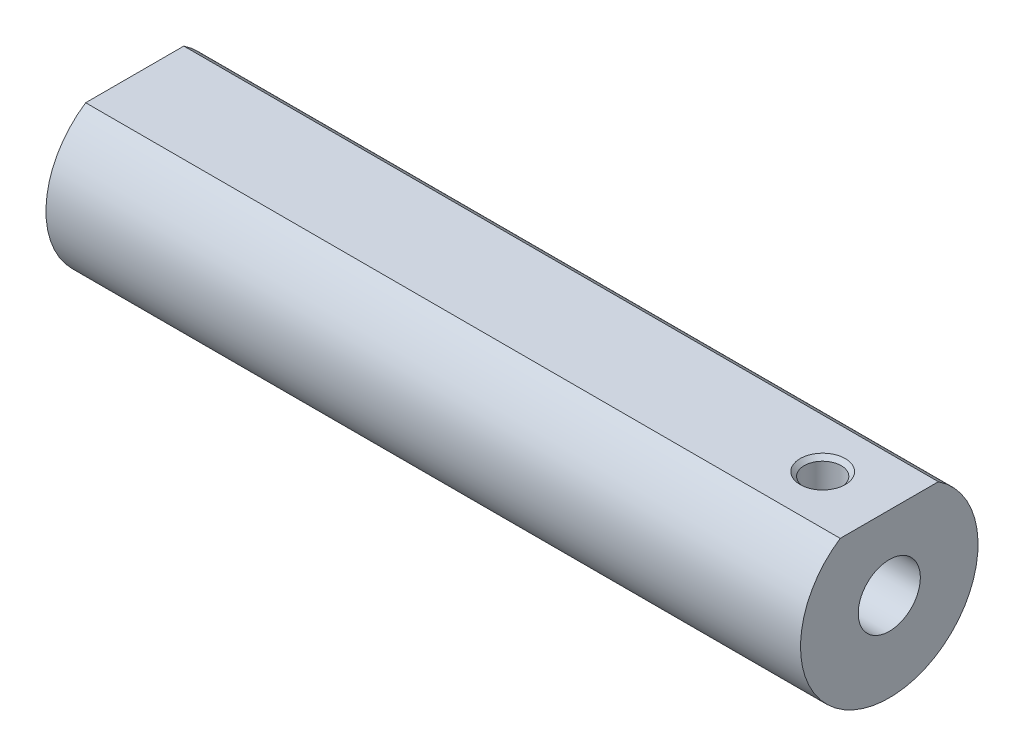
ISO-10303-21;
HEADER;
FILE_DESCRIPTION(('STEP AP214'),'2;1');
FILE_NAME('part.step','',(''),(''),'','','');
FILE_SCHEMA(('AUTOMOTIVE_DESIGN { 1 0 10303 214 1 1 1 1 }'));
ENDSEC;
DATA;
#1=APPLICATION_CONTEXT('core data for automotive mechanical design processes');
#2=APPLICATION_PROTOCOL_DEFINITION('international standard','automotive_design',2000,#1);
#3=PRODUCT_CONTEXT('',#1,'mechanical');
#4=PRODUCT('Part','Part','',(#3));
#5=PRODUCT_RELATED_PRODUCT_CATEGORY('part','',(#4));
#6=PRODUCT_DEFINITION_FORMATION('','',#4);
#7=PRODUCT_DEFINITION_CONTEXT('part definition',#1,'design');
#8=PRODUCT_DEFINITION('design','',#6,#7);
#9=PRODUCT_DEFINITION_SHAPE('','',#8);
#10=(LENGTH_UNIT() NAMED_UNIT(*) SI_UNIT(.MILLI.,.METRE.));
#11=(NAMED_UNIT(*) PLANE_ANGLE_UNIT() SI_UNIT($,.RADIAN.));
#12=(NAMED_UNIT(*) SI_UNIT($,.STERADIAN.) SOLID_ANGLE_UNIT());
#13=UNCERTAINTY_MEASURE_WITH_UNIT(LENGTH_MEASURE(1.E-05),#10,'distance_accuracy_value','');
#14=(GEOMETRIC_REPRESENTATION_CONTEXT(3) GLOBAL_UNCERTAINTY_ASSIGNED_CONTEXT((#13)) GLOBAL_UNIT_ASSIGNED_CONTEXT((#10,
#11,#12)) REPRESENTATION_CONTEXT('',''));
#15=CARTESIAN_POINT('',(0.,0.,0.));
#16=DIRECTION('',(0.,0.,1.));
#17=DIRECTION('',(1.,0.,0.));
#18=AXIS2_PLACEMENT_3D('',#15,#16,#17);
#19=CARTESIAN_POINT('',(51.,0.,0.));
#20=DIRECTION('',(-1.,0.,0.));
#21=DIRECTION('',(0.,0.,1.));
#22=AXIS2_PLACEMENT_3D('',#19,#20,#21);
#23=CYLINDRICAL_SURFACE('',#22,6.);
#24=DIRECTION('',(1.,0.,0.));
#25=VECTOR('',#24,1.);
#26=CARTESIAN_POINT('',(39.,5.,3.3166247903554));
#27=LINE('',#26,#25);
#28=CARTESIAN_POINT('',(0.,5.,3.3166247903554));
#29=VERTEX_POINT('',#28);
#30=CARTESIAN_POINT('',(51.,5.,3.3166247903554));
#31=VERTEX_POINT('',#30);
#32=EDGE_CURVE('E66',#29,#31,#27,.T.);
#33=ORIENTED_EDGE('',*,*,#32,.F.);
#34=CARTESIAN_POINT('',(0.,0.,0.));
#35=DIRECTION('',(1.,0.,0.));
#36=DIRECTION('',(0.,0.,-1.));
#37=AXIS2_PLACEMENT_3D('',#34,#35,#36);
#38=CIRCLE('',#37,6.);
#39=CARTESIAN_POINT('',(0.,5.,-3.3166247903554));
#40=VERTEX_POINT('',#39);
#41=EDGE_CURVE('E58',#29,#40,#38,.T.);
#42=ORIENTED_EDGE('',*,*,#41,.T.);
#43=DIRECTION('',(1.,0.,0.));
#44=VECTOR('',#43,1.);
#45=CARTESIAN_POINT('',(39.,5.,-3.3166247903554));
#46=LINE('',#45,#44);
#47=CARTESIAN_POINT('',(51.,5.,-3.3166247903554));
#48=VERTEX_POINT('',#47);
#49=EDGE_CURVE('E80',#40,#48,#46,.T.);
#50=ORIENTED_EDGE('',*,*,#49,.T.);
#51=CARTESIAN_POINT('',(51.,0.,0.));
#52=DIRECTION('',(1.,0.,0.));
#53=DIRECTION('',(0.,0.,-1.));
#54=AXIS2_PLACEMENT_3D('',#51,#52,#53);
#55=CIRCLE('',#54,6.);
#56=EDGE_CURVE('E11',#31,#48,#55,.T.);
#57=ORIENTED_EDGE('',*,*,#56,.F.);
#58=EDGE_LOOP('',(#33,#42,#50,#57));
#59=FACE_BOUND('',#58,.T.);
#60=ADVANCED_FACE('F44',(#59),#23,.T.);
#61=CARTESIAN_POINT('',(51.,0.,0.));
#62=DIRECTION('',(1.,0.,0.));
#63=DIRECTION('',(0.,0.,-1.));
#64=AXIS2_PLACEMENT_3D('',#61,#62,#63);
#65=PLANE('',#64);
#66=CARTESIAN_POINT('',(51.,0.,0.));
#67=DIRECTION('',(1.,0.,0.));
#68=DIRECTION('',(0.,0.,-1.));
#69=AXIS2_PLACEMENT_3D('',#66,#67,#68);
#70=CIRCLE('',#69,2.1);
#71=CARTESIAN_POINT('',(51.,0.,-2.1));
#72=VERTEX_POINT('',#71);
#73=EDGE_CURVE('E94',#72,#72,#70,.T.);
#74=ORIENTED_EDGE('',*,*,#73,.F.);
#75=EDGE_LOOP('',(#74));
#76=FACE_BOUND('',#75,.T.);
#77=DIRECTION('',(0.,0.,-1.));
#78=VECTOR('',#77,1.);
#79=CARTESIAN_POINT('',(51.,5.,3.3166247903554));
#80=LINE('',#79,#78);
#81=EDGE_CURVE('E70',#31,#48,#80,.T.);
#82=ORIENTED_EDGE('',*,*,#81,.F.);
#83=ORIENTED_EDGE('',*,*,#56,.T.);
#84=EDGE_LOOP('',(#82,#83));
#85=FACE_BOUND('',#84,.T.);
#86=ADVANCED_FACE('F124',(#76,#85),#65,.T.);
#87=CARTESIAN_POINT('',(0.,0.,0.));
#88=DIRECTION('',(1.,0.,0.));
#89=DIRECTION('',(0.,0.,-1.));
#90=AXIS2_PLACEMENT_3D('',#87,#88,#89);
#91=PLANE('',#90);
#92=ORIENTED_EDGE('',*,*,#41,.F.);
#93=DIRECTION('',(0.,0.,1.));
#94=VECTOR('',#93,1.);
#95=CARTESIAN_POINT('',(0.,5.,3.3166247903554));
#96=LINE('',#95,#94);
#97=EDGE_CURVE('E83',#40,#29,#96,.T.);
#98=ORIENTED_EDGE('',*,*,#97,.F.);
#99=EDGE_LOOP('',(#92,#98));
#100=FACE_BOUND('',#99,.T.);
#101=ADVANCED_FACE('F89',(#100),#91,.F.);
#102=CARTESIAN_POINT('',(39.,5.,3.3166247903554));
#103=DIRECTION('',(0.,-1.,0.));
#104=DIRECTION('',(0.,0.,-1.));
#105=AXIS2_PLACEMENT_3D('',#102,#103,#104);
#106=PLANE('',#105);
#107=CARTESIAN_POINT('',(46.5,5.,0.));
#108=DIRECTION('',(0.,1.,0.));
#109=DIRECTION('',(0.,0.,1.));
#110=AXIS2_PLACEMENT_3D('',#107,#108,#109);
#111=CIRCLE('',#110,1.525);
#112=CARTESIAN_POINT('',(46.5,5.,1.525));
#113=VERTEX_POINT('',#112);
#114=EDGE_CURVE('E87',#113,#113,#111,.T.);
#115=ORIENTED_EDGE('',*,*,#114,.F.);
#116=EDGE_LOOP('',(#115));
#117=FACE_BOUND('',#116,.T.);
#118=ORIENTED_EDGE('',*,*,#81,.T.);
#119=ORIENTED_EDGE('',*,*,#49,.F.);
#120=ORIENTED_EDGE('',*,*,#97,.T.);
#121=ORIENTED_EDGE('',*,*,#32,.T.);
#122=EDGE_LOOP('',(#118,#119,#120,#121));
#123=FACE_BOUND('',#122,.T.);
#124=ADVANCED_FACE('F84',(#117,#123),#106,.F.);
#125=CARTESIAN_POINT('',(39.,0.,0.));
#126=DIRECTION('',(1.,0.,0.));
#127=DIRECTION('',(0.,0.,-1.));
#128=AXIS2_PLACEMENT_3D('',#125,#126,#127);
#129=CYLINDRICAL_SURFACE('',#128,2.1);
#130=CARTESIAN_POINT('',(46.5,1.68745370306862,1.25));
#131=CARTESIAN_POINT('',(46.5630192311576,1.68745034276093,1.25000239170537));
#132=CARTESIAN_POINT('',(46.6260265436687,1.69103664835488,1.2452052945159));
#133=CARTESIAN_POINT('',(46.7499325290739,1.70474679595876,1.22636400209902));
#134=CARTESIAN_POINT('',(46.8108289583839,1.71487738194761,1.21231026747486));
#135=CARTESIAN_POINT('',(46.9284530439853,1.74005212591713,1.17588198139134));
#136=CARTESIAN_POINT('',(46.9852069081931,1.75506137659342,1.15356639107477));
#137=CARTESIAN_POINT('',(47.0941300226748,1.78823768182833,1.101435115082));
#138=CARTESIAN_POINT('',(47.1462978575592,1.80640570616565,1.0716171248247));
#139=CARTESIAN_POINT('',(47.2514453690903,1.84649110482345,1.00115043304534));
#140=CARTESIAN_POINT('',(47.3037698733155,1.86859670954315,0.959630993855102));
#141=CARTESIAN_POINT('',(47.4012555086327,1.91255543772763,0.868725768563943));
#142=CARTESIAN_POINT('',(47.446411359201,1.93440836418131,0.819334236951262));
#143=CARTESIAN_POINT('',(47.5329974538588,1.97814131824754,0.707751265668703));
#144=CARTESIAN_POINT('',(47.5735292153055,1.99977999560899,0.644758669644053));
#145=CARTESIAN_POINT('',(47.6431106257074,2.03797831640918,0.511315653757206));
#146=CARTESIAN_POINT('',(47.6721706288071,2.05454253689691,0.440872032182761));
#147=CARTESIAN_POINT('',(47.7150603848731,2.07932594428391,0.301543066903678));
#148=CARTESIAN_POINT('',(47.7300676709908,2.08818462949669,0.233136879738546));
#149=CARTESIAN_POINT('',(47.7484015847223,2.09903519500877,0.0942622194112565));
#150=CARTESIAN_POINT('',(47.7517389576397,2.10103339220748,0.0237957036670273));
#151=CARTESIAN_POINT('',(47.7468594074291,2.09813230682546,-0.107922091393409));
#152=CARTESIAN_POINT('',(47.7400034539947,2.09404538379903,-0.169248048248889));
#153=CARTESIAN_POINT('',(47.7175103381101,2.0808047977609,-0.289691993214679));
#154=CARTESIAN_POINT('',(47.7018725261373,2.0716507599766,-0.3488098176624));
#155=CARTESIAN_POINT('',(47.6623898011296,2.04899680484598,-0.463756390686283));
#156=CARTESIAN_POINT('',(47.6384933110424,2.03546961141652,-0.51956182317357));
#157=CARTESIAN_POINT('',(47.5833689039595,2.00515802585832,-0.626443543108458));
#158=CARTESIAN_POINT('',(47.5521390388091,1.98837276841128,-0.677518568859075));
#159=CARTESIAN_POINT('',(47.4790601583789,1.95063185016377,-0.779972276402236));
#160=CARTESIAN_POINT('',(47.4363915466233,1.92941771348558,-0.83067059503927));
#161=CARTESIAN_POINT('',(47.3437657860102,1.88620283074345,-0.924618522714003));
#162=CARTESIAN_POINT('',(47.2937989325495,1.86420106723209,-0.967858044033169));
#163=CARTESIAN_POINT('',(47.1812907873966,1.81898477622687,-1.05059846125122));
#164=CARTESIAN_POINT('',(47.1179664458326,1.79591463396037,-1.08912301738905));
#165=CARTESIAN_POINT('',(46.9842899057999,1.75443308799015,-1.1547644611159));
#166=CARTESIAN_POINT('',(46.9139509009269,1.7360131601126,-1.18190228277606));
#167=CARTESIAN_POINT('',(46.7858851226796,1.71064674722224,-1.21821699755716));
#168=CARTESIAN_POINT('',(46.7292816081902,1.70199591964791,-1.23016347646417));
#169=CARTESIAN_POINT('',(46.6144165443461,1.6903673259053,-1.24609814114004));
#170=CARTESIAN_POINT('',(46.5561569385159,1.68738316760645,-1.25009529416871));
#171=CARTESIAN_POINT('',(46.4395898365089,1.68752691741201,-1.24990108934575));
#172=CARTESIAN_POINT('',(46.3812823701171,1.69066238296346,-1.24569960656654));
#173=CARTESIAN_POINT('',(46.2663748605811,1.70258759488902,-1.22934677297279));
#174=CARTESIAN_POINT('',(46.2097761872281,1.71138175763188,-1.21718921265711));
#175=CARTESIAN_POINT('',(46.0995619924233,1.73347146455646,-1.18551473616481));
#176=CARTESIAN_POINT('',(46.0459504784931,1.74677289397925,-1.16598819433117));
#177=CARTESIAN_POINT('',(45.9425839324995,1.77644476006853,-1.12026143452765));
#178=CARTESIAN_POINT('',(45.8928303840784,1.792816369229,-1.09405866554755));
#179=CARTESIAN_POINT('',(45.7892037585805,1.83029976738453,-1.03033888875091));
#180=CARTESIAN_POINT('',(45.7361750413207,1.85173649059898,-0.991637973400164));
#181=CARTESIAN_POINT('',(45.6368225722392,1.89488021916018,-0.906483003373531));
#182=CARTESIAN_POINT('',(45.5905051834923,1.91658746008854,-0.860021679648039));
#183=CARTESIAN_POINT('',(45.5000764318376,1.96102224478626,-0.753727848369381));
#184=CARTESIAN_POINT('',(45.4569600053646,1.98353959676391,-0.692950483156728));
#185=CARTESIAN_POINT('',(45.381749366828,2.02410025456373,-0.563561688748352));
#186=CARTESIAN_POINT('',(45.3496475391003,2.04214664926578,-0.494955716285501));
#187=CARTESIAN_POINT('',(45.3000302035388,2.07051819156576,-0.35711109784192));
#188=CARTESIAN_POINT('',(45.2816056077038,2.08131870797545,-0.288301009307308));
#189=CARTESIAN_POINT('',(45.2567344017871,2.09597346751215,-0.147852772792834));
#190=CARTESIAN_POINT('',(45.250274763619,2.09983526574944,-0.0762177876473251));
#191=CARTESIAN_POINT('',(45.2497767685595,2.10013390576013,0.0577119901697093));
#192=CARTESIAN_POINT('',(45.2542272574617,2.09747404829512,0.120005553898401));
#193=CARTESIAN_POINT('',(45.2722362803695,2.08682788032037,0.24278552974218));
#194=CARTESIAN_POINT('',(45.285794991524,2.07884146621268,0.303271906684792));
#195=CARTESIAN_POINT('',(45.321142182339,2.05839790557038,0.420088871922345));
#196=CARTESIAN_POINT('',(45.3428231431465,2.04599926911538,0.476462730954944));
#197=CARTESIAN_POINT('',(45.3936098606004,2.01771031042447,0.584793343285846));
#198=CARTESIAN_POINT('',(45.4227173322027,2.00181918180766,0.636749072634313));
#199=CARTESIAN_POINT('',(45.4910908374134,1.96582330806447,0.740874016461119));
#200=CARTESIAN_POINT('',(45.5311185738934,1.94544803303791,0.792448498803122));
#201=CARTESIAN_POINT('',(45.6184138005408,1.90347784737556,0.888554053336327));
#202=CARTESIAN_POINT('',(45.665689497915,1.88188157186534,0.93307702309558));
#203=CARTESIAN_POINT('',(45.7729805629116,1.83668242030002,1.01943750865136));
#204=CARTESIAN_POINT('',(45.8338480027232,1.8131604502897,1.06026705449079));
#205=CARTESIAN_POINT('',(45.9628256980734,1.76985422427021,1.13108089433832));
#206=CARTESIAN_POINT('',(46.0309305477757,1.7500672087589,1.16107321033154));
#207=CARTESIAN_POINT('',(46.1650612090628,1.71927958106148,1.20612794207763));
#208=CARTESIAN_POINT('',(46.2304782834758,1.70754734237367,1.22247828909729));
#209=CARTESIAN_POINT('',(46.3639383649957,1.69164340542759,1.24440278068202));
#210=CARTESIAN_POINT('',(46.4319761259184,1.68745733023358,1.24999741835847));
#211=CARTESIAN_POINT('',(46.5,1.68745370306862,1.25));
#212=B_SPLINE_CURVE_WITH_KNOTS('',3,(#130,#131,#132,#133,#134,#135,#136,#137,#138,#139,#140,
#141,#142,#143,#144,#145,#146,#147,#148,#149,#150,#151,#152,#153,#154,#155,#156,#157,#158,#159,
#160,#161,#162,#163,#164,#165,#166,#167,#168,#169,#170,#171,#172,#173,#174,#175,#176,#177,#178,
#179,#180,#181,#182,#183,#184,#185,#186,#187,#188,#189,#190,#191,#192,#193,#194,#195,#196,#197,
#198,#199,#200,#201,#202,#203,#204,#205,#206,#207,#208,#209,#210,#211),.UNSPECIFIED.,.T.,.F.,(4,
2,2,2,2,2,2,2,2,2,2,2,2,2,2,2,2,2,2,2,2,2,2,2,2,2,2,2,2,2,2,2,2,2,2,2,2,2,2,2,4),(0.,
0.188772639417391,0.377740122865091,0.565384239535798,0.753086067095719,0.963334171309888,
1.17373643553012,1.40638111617897,1.63881533436263,1.8493372908065,2.059665353874,
2.24431343623345,2.42897517731077,2.61481165375327,2.80069755472559,3.00859735467037,
3.21677616284582,3.44850612430269,3.67980817246213,3.85453493733676,4.02906448913155,
4.20380971307999,4.37869148381784,4.55380248725226,4.72898050183366,4.93535623614868,
5.14192637463615,5.37424988463874,5.60641243733642,5.82126513335371,6.03588374841858,
6.222490910644,6.40910170235933,6.59332482551205,6.77759052867913,6.98195306204528,
7.18654873759308,7.41637069568085,7.64602218367847,7.85017547961913,8.05393941037331),.UNSPECIFIED.);
#213=CARTESIAN_POINT('',(46.5,1.68745370306862,1.25));
#214=VERTEX_POINT('',#213);
#215=EDGE_CURVE('E47',#214,#214,#212,.T.);
#216=ORIENTED_EDGE('',*,*,#215,.T.);
#217=EDGE_LOOP('',(#216));
#218=FACE_BOUND('',#217,.T.);
#219=CARTESIAN_POINT('',(39.,0.,0.));
#220=DIRECTION('',(1.,0.,0.));
#221=DIRECTION('',(0.,0.,-1.));
#222=AXIS2_PLACEMENT_3D('',#219,#220,#221);
#223=CIRCLE('',#222,2.1);
#224=CARTESIAN_POINT('',(39.,0.,-2.1));
#225=VERTEX_POINT('',#224);
#226=EDGE_CURVE('E91',#225,#225,#223,.T.);
#227=ORIENTED_EDGE('',*,*,#226,.F.);
#228=EDGE_LOOP('',(#227));
#229=FACE_BOUND('',#228,.T.);
#230=ORIENTED_EDGE('',*,*,#73,.T.);
#231=EDGE_LOOP('',(#230));
#232=FACE_BOUND('',#231,.T.);
#233=ADVANCED_FACE('F115',(#218,#229,#232),#129,.F.);
#234=CARTESIAN_POINT('',(39.,0.,0.));
#235=DIRECTION('',(1.,0.,0.));
#236=DIRECTION('',(0.,0.,-1.));
#237=AXIS2_PLACEMENT_3D('',#234,#235,#236);
#238=PLANE('',#237);
#239=ORIENTED_EDGE('',*,*,#226,.T.);
#240=EDGE_LOOP('',(#239));
#241=FACE_BOUND('',#240,.T.);
#242=ADVANCED_FACE('F121',(#241),#238,.T.);
#243=CARTESIAN_POINT('',(46.5,5.,0.));
#244=DIRECTION('',(0.,1.,0.));
#245=DIRECTION('',(0.,0.,1.));
#246=AXIS2_PLACEMENT_3D('',#243,#244,#245);
#247=CYLINDRICAL_SURFACE('',#246,1.25);
#248=CARTESIAN_POINT('',(46.5,4.725,0.));
#249=DIRECTION('',(0.,1.,0.));
#250=DIRECTION('',(0.,0.,1.));
#251=AXIS2_PLACEMENT_3D('',#248,#249,#250);
#252=CIRCLE('',#251,1.25);
#253=CARTESIAN_POINT('',(46.5,4.725,1.25));
#254=VERTEX_POINT('',#253);
#255=EDGE_CURVE('E104',#254,#254,#252,.T.);
#256=ORIENTED_EDGE('',*,*,#255,.T.);
#257=EDGE_LOOP('',(#256));
#258=FACE_BOUND('',#257,.T.);
#259=ORIENTED_EDGE('',*,*,#215,.F.);
#260=EDGE_LOOP('',(#259));
#261=FACE_BOUND('',#260,.T.);
#262=ADVANCED_FACE('F157',(#258,#261),#247,.F.);
#263=CARTESIAN_POINT('',(46.5,5.,0.));
#264=DIRECTION('',(0.,1.,0.));
#265=DIRECTION('',(0.,0.,1.));
#266=AXIS2_PLACEMENT_3D('',#263,#264,#265);
#267=CONICAL_SURFACE('',#266,1.525,0.785398163397439);
#268=ORIENTED_EDGE('',*,*,#255,.F.);
#269=EDGE_LOOP('',(#268));
#270=FACE_BOUND('',#269,.T.);
#271=ORIENTED_EDGE('',*,*,#114,.T.);
#272=EDGE_LOOP('',(#271));
#273=FACE_BOUND('',#272,.T.);
#274=ADVANCED_FACE('F112',(#270,#273),#267,.F.);
#275=CLOSED_SHELL('',(#60,#86,#101,#124,#233,#242,#262,#274));
#276=MANIFOLD_SOLID_BREP('B2',#275);
#277=ADVANCED_BREP_SHAPE_REPRESENTATION('',(#18,#276),#14);
#278=SHAPE_DEFINITION_REPRESENTATION(#9,#277);
ENDSEC;
END-ISO-10303-21;
